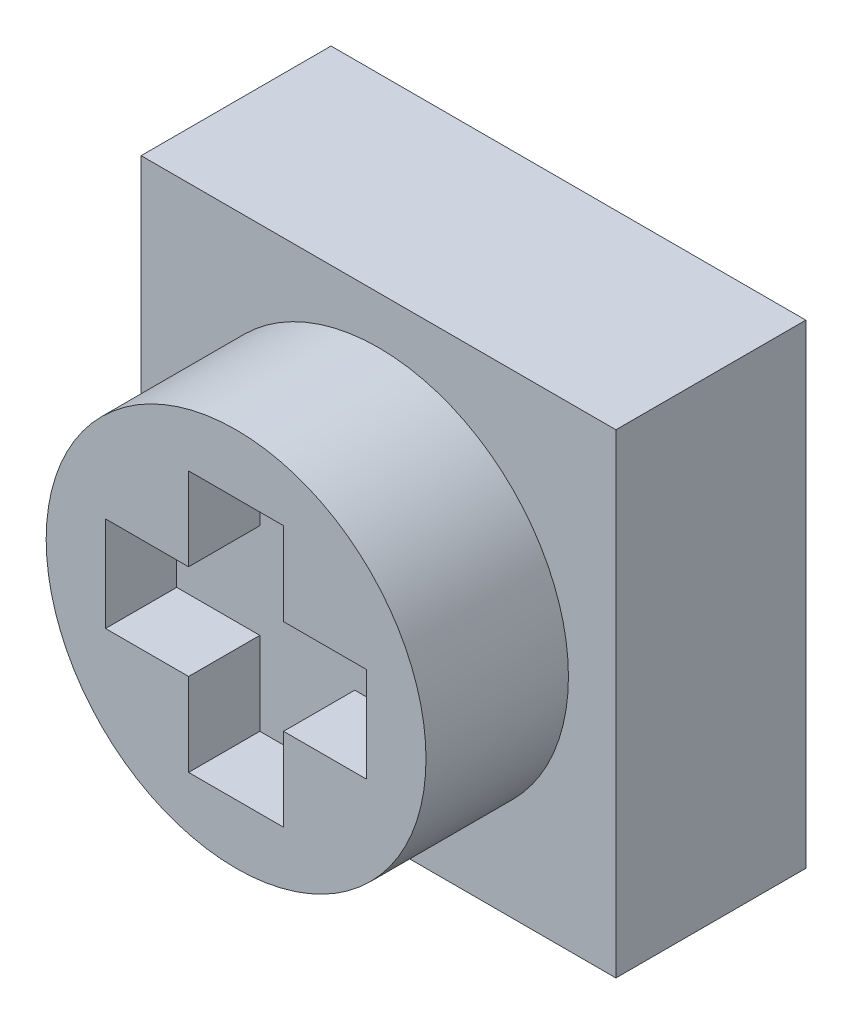
ISO-10303-21;
HEADER;
FILE_DESCRIPTION(('STEP AP214'),'2;1');
FILE_NAME('part.step','',(''),(''),'','','');
FILE_SCHEMA(('AUTOMOTIVE_DESIGN { 1 0 10303 214 1 1 1 1 }'));
ENDSEC;
DATA;
#1=APPLICATION_CONTEXT('core data for automotive mechanical design processes');
#2=APPLICATION_PROTOCOL_DEFINITION('international standard','automotive_design',2000,#1);
#3=PRODUCT_CONTEXT('',#1,'mechanical');
#4=PRODUCT('Part','Part','',(#3));
#5=PRODUCT_RELATED_PRODUCT_CATEGORY('part','',(#4));
#6=PRODUCT_DEFINITION_FORMATION('','',#4);
#7=PRODUCT_DEFINITION_CONTEXT('part definition',#1,'design');
#8=PRODUCT_DEFINITION('design','',#6,#7);
#9=PRODUCT_DEFINITION_SHAPE('','',#8);
#10=(LENGTH_UNIT() NAMED_UNIT(*) SI_UNIT(.MILLI.,.METRE.));
#11=(NAMED_UNIT(*) PLANE_ANGLE_UNIT() SI_UNIT($,.RADIAN.));
#12=(NAMED_UNIT(*) SI_UNIT($,.STERADIAN.) SOLID_ANGLE_UNIT());
#13=UNCERTAINTY_MEASURE_WITH_UNIT(LENGTH_MEASURE(1.E-05),#10,'distance_accuracy_value','');
#14=(GEOMETRIC_REPRESENTATION_CONTEXT(3) GLOBAL_UNCERTAINTY_ASSIGNED_CONTEXT((#13)) GLOBAL_UNIT_ASSIGNED_CONTEXT((#10,
#11,#12)) REPRESENTATION_CONTEXT('',''));
#15=CARTESIAN_POINT('',(0.,0.,0.));
#16=DIRECTION('',(0.,0.,1.));
#17=DIRECTION('',(1.,0.,0.));
#18=AXIS2_PLACEMENT_3D('',#15,#16,#17);
#19=CARTESIAN_POINT('',(0.,0.,4.));
#20=DIRECTION('',(1.,0.,0.));
#21=DIRECTION('',(0.,0.,-1.));
#22=AXIS2_PLACEMENT_3D('',#19,#20,#21);
#23=PLANE('',#22);
#24=DIRECTION('',(0.,-1.,0.));
#25=VECTOR('',#24,1.);
#26=CARTESIAN_POINT('',(0.,0.,0.));
#27=LINE('',#26,#25);
#28=CARTESIAN_POINT('',(0.,0.,0.));
#29=VERTEX_POINT('',#28);
#30=CARTESIAN_POINT('',(0.,-10.,0.));
#31=VERTEX_POINT('',#30);
#32=EDGE_CURVE('E264',#29,#31,#27,.T.);
#33=ORIENTED_EDGE('',*,*,#32,.T.);
#34=DIRECTION('',(0.,0.,-1.));
#35=VECTOR('',#34,1.);
#36=CARTESIAN_POINT('',(0.,-10.,4.));
#37=LINE('',#36,#35);
#38=CARTESIAN_POINT('',(0.,-10.,4.));
#39=VERTEX_POINT('',#38);
#40=EDGE_CURVE('E40',#39,#31,#37,.T.);
#41=ORIENTED_EDGE('',*,*,#40,.F.);
#42=DIRECTION('',(0.,-1.,0.));
#43=VECTOR('',#42,1.);
#44=CARTESIAN_POINT('',(0.,0.,4.));
#45=LINE('',#44,#43);
#46=CARTESIAN_POINT('',(0.,0.,4.));
#47=VERTEX_POINT('',#46);
#48=EDGE_CURVE('E266',#47,#39,#45,.T.);
#49=ORIENTED_EDGE('',*,*,#48,.F.);
#50=DIRECTION('',(0.,0.,-1.));
#51=VECTOR('',#50,1.);
#52=CARTESIAN_POINT('',(0.,0.,4.));
#53=LINE('',#52,#51);
#54=EDGE_CURVE('E272',#47,#29,#53,.T.);
#55=ORIENTED_EDGE('',*,*,#54,.T.);
#56=EDGE_LOOP('',(#33,#41,#49,#55));
#57=FACE_BOUND('',#56,.T.);
#58=ADVANCED_FACE('F37',(#57),#23,.F.);
#59=CARTESIAN_POINT('',(0.,-10.,4.));
#60=DIRECTION('',(0.,1.,0.));
#61=DIRECTION('',(0.,0.,1.));
#62=AXIS2_PLACEMENT_3D('',#59,#60,#61);
#63=PLANE('',#62);
#64=DIRECTION('',(1.,0.,0.));
#65=VECTOR('',#64,1.);
#66=CARTESIAN_POINT('',(0.,-10.,0.));
#67=LINE('',#66,#65);
#68=CARTESIAN_POINT('',(10.,-10.,0.));
#69=VERTEX_POINT('',#68);
#70=EDGE_CURVE('E275',#31,#69,#67,.T.);
#71=ORIENTED_EDGE('',*,*,#70,.T.);
#72=DIRECTION('',(0.,0.,-1.));
#73=VECTOR('',#72,1.);
#74=CARTESIAN_POINT('',(10.,-10.,4.));
#75=LINE('',#74,#73);
#76=CARTESIAN_POINT('',(10.,-10.,4.));
#77=VERTEX_POINT('',#76);
#78=EDGE_CURVE('E282',#77,#69,#75,.T.);
#79=ORIENTED_EDGE('',*,*,#78,.F.);
#80=DIRECTION('',(1.,0.,0.));
#81=VECTOR('',#80,1.);
#82=CARTESIAN_POINT('',(0.,-10.,4.));
#83=LINE('',#82,#81);
#84=EDGE_CURVE('E90',#39,#77,#83,.T.);
#85=ORIENTED_EDGE('',*,*,#84,.F.);
#86=ORIENTED_EDGE('',*,*,#40,.T.);
#87=EDGE_LOOP('',(#71,#79,#85,#86));
#88=FACE_BOUND('',#87,.T.);
#89=ADVANCED_FACE('F288',(#88),#63,.F.);
#90=CARTESIAN_POINT('',(10.,0.,4.));
#91=DIRECTION('',(-1.,0.,0.));
#92=DIRECTION('',(0.,-1.,0.));
#93=AXIS2_PLACEMENT_3D('',#90,#91,#92);
#94=PLANE('',#93);
#95=DIRECTION('',(0.,1.,0.));
#96=VECTOR('',#95,1.);
#97=CARTESIAN_POINT('',(10.,0.,0.));
#98=LINE('',#97,#96);
#99=CARTESIAN_POINT('',(10.,0.,0.));
#100=VERTEX_POINT('',#99);
#101=EDGE_CURVE('E277',#69,#100,#98,.T.);
#102=ORIENTED_EDGE('',*,*,#101,.T.);
#103=DIRECTION('',(0.,0.,-1.));
#104=VECTOR('',#103,1.);
#105=CARTESIAN_POINT('',(10.,0.,4.));
#106=LINE('',#105,#104);
#107=CARTESIAN_POINT('',(10.,0.,4.));
#108=VERTEX_POINT('',#107);
#109=EDGE_CURVE('E281',#108,#100,#106,.T.);
#110=ORIENTED_EDGE('',*,*,#109,.F.);
#111=DIRECTION('',(0.,1.,0.));
#112=VECTOR('',#111,1.);
#113=CARTESIAN_POINT('',(10.,0.,4.));
#114=LINE('',#113,#112);
#115=EDGE_CURVE('E269',#77,#108,#114,.T.);
#116=ORIENTED_EDGE('',*,*,#115,.F.);
#117=ORIENTED_EDGE('',*,*,#78,.T.);
#118=EDGE_LOOP('',(#102,#110,#116,#117));
#119=FACE_BOUND('',#118,.T.);
#120=ADVANCED_FACE('F295',(#119),#94,.F.);
#121=CARTESIAN_POINT('',(0.,0.,4.));
#122=DIRECTION('',(0.,-1.,0.));
#123=DIRECTION('',(0.,0.,-1.));
#124=AXIS2_PLACEMENT_3D('',#121,#122,#123);
#125=PLANE('',#124);
#126=DIRECTION('',(-1.,0.,0.));
#127=VECTOR('',#126,1.);
#128=CARTESIAN_POINT('',(0.,0.,0.));
#129=LINE('',#128,#127);
#130=EDGE_CURVE('E82',#100,#29,#129,.T.);
#131=ORIENTED_EDGE('',*,*,#130,.T.);
#132=ORIENTED_EDGE('',*,*,#54,.F.);
#133=DIRECTION('',(-1.,0.,0.));
#134=VECTOR('',#133,1.);
#135=CARTESIAN_POINT('',(0.,0.,4.));
#136=LINE('',#135,#134);
#137=EDGE_CURVE('E61',#108,#47,#136,.T.);
#138=ORIENTED_EDGE('',*,*,#137,.F.);
#139=ORIENTED_EDGE('',*,*,#109,.T.);
#140=EDGE_LOOP('',(#131,#132,#138,#139));
#141=FACE_BOUND('',#140,.T.);
#142=ADVANCED_FACE('F296',(#141),#125,.F.);
#143=CARTESIAN_POINT('',(0.,0.,4.));
#144=DIRECTION('',(0.,0.,1.));
#145=DIRECTION('',(1.,0.,0.));
#146=AXIS2_PLACEMENT_3D('',#143,#144,#145);
#147=PLANE('',#146);
#148=CARTESIAN_POINT('',(5.,-5.,4.));
#149=DIRECTION('',(0.,0.,1.));
#150=DIRECTION('',(1.,0.,0.));
#151=AXIS2_PLACEMENT_3D('',#148,#149,#150);
#152=CIRCLE('',#151,4.);
#153=CARTESIAN_POINT('',(9.,-5.,4.));
#154=VERTEX_POINT('',#153);
#155=EDGE_CURVE('E11',#154,#154,#152,.T.);
#156=ORIENTED_EDGE('',*,*,#155,.F.);
#157=EDGE_LOOP('',(#156));
#158=FACE_BOUND('',#157,.T.);
#159=ORIENTED_EDGE('',*,*,#48,.T.);
#160=ORIENTED_EDGE('',*,*,#84,.T.);
#161=ORIENTED_EDGE('',*,*,#115,.T.);
#162=ORIENTED_EDGE('',*,*,#137,.T.);
#163=EDGE_LOOP('',(#159,#160,#161,#162));
#164=FACE_BOUND('',#163,.T.);
#165=ADVANCED_FACE('F297',(#158,#164),#147,.T.);
#166=CARTESIAN_POINT('',(0.,0.,0.));
#167=DIRECTION('',(0.,0.,1.));
#168=DIRECTION('',(1.,0.,0.));
#169=AXIS2_PLACEMENT_3D('',#166,#167,#168);
#170=PLANE('',#169);
#171=ORIENTED_EDGE('',*,*,#32,.F.);
#172=ORIENTED_EDGE('',*,*,#130,.F.);
#173=ORIENTED_EDGE('',*,*,#101,.F.);
#174=ORIENTED_EDGE('',*,*,#70,.F.);
#175=EDGE_LOOP('',(#171,#172,#173,#174));
#176=FACE_BOUND('',#175,.T.);
#177=ADVANCED_FACE('F293',(#176),#170,.F.);
#178=CARTESIAN_POINT('',(5.,-5.,7.));
#179=DIRECTION('',(0.,0.,-1.));
#180=DIRECTION('',(-1.,0.,0.));
#181=AXIS2_PLACEMENT_3D('',#178,#179,#180);
#182=CYLINDRICAL_SURFACE('',#181,4.);
#183=CARTESIAN_POINT('',(5.,-5.,7.));
#184=DIRECTION('',(0.,0.,1.));
#185=DIRECTION('',(1.,0.,0.));
#186=AXIS2_PLACEMENT_3D('',#183,#184,#185);
#187=CIRCLE('',#186,4.);
#188=CARTESIAN_POINT('',(9.,-5.,7.));
#189=VERTEX_POINT('',#188);
#190=EDGE_CURVE('E243',#189,#189,#187,.T.);
#191=ORIENTED_EDGE('',*,*,#190,.F.);
#192=EDGE_LOOP('',(#191));
#193=FACE_BOUND('',#192,.T.);
#194=ORIENTED_EDGE('',*,*,#155,.T.);
#195=EDGE_LOOP('',(#194));
#196=FACE_BOUND('',#195,.T.);
#197=ADVANCED_FACE('F305',(#193,#196),#182,.T.);
#198=CARTESIAN_POINT('',(5.,-5.,7.));
#199=DIRECTION('',(0.,0.,1.));
#200=DIRECTION('',(1.,0.,0.));
#201=AXIS2_PLACEMENT_3D('',#198,#199,#200);
#202=PLANE('',#201);
#203=DIRECTION('',(-1.,0.,0.));
#204=VECTOR('',#203,1.);
#205=CARTESIAN_POINT('',(6.,-2.25,7.));
#206=LINE('',#205,#204);
#207=CARTESIAN_POINT('',(6.,-2.25,7.));
#208=VERTEX_POINT('',#207);
#209=CARTESIAN_POINT('',(4.,-2.25,7.));
#210=VERTEX_POINT('',#209);
#211=EDGE_CURVE('E52',#208,#210,#206,.T.);
#212=ORIENTED_EDGE('',*,*,#211,.F.);
#213=DIRECTION('',(0.,1.,0.));
#214=VECTOR('',#213,1.);
#215=CARTESIAN_POINT('',(6.,-4.,7.));
#216=LINE('',#215,#214);
#217=CARTESIAN_POINT('',(6.,-4.,7.));
#218=VERTEX_POINT('',#217);
#219=EDGE_CURVE('E181',#218,#208,#216,.T.);
#220=ORIENTED_EDGE('',*,*,#219,.F.);
#221=DIRECTION('',(-1.,0.,0.));
#222=VECTOR('',#221,1.);
#223=CARTESIAN_POINT('',(7.75,-4.,7.));
#224=LINE('',#223,#222);
#225=CARTESIAN_POINT('',(7.75,-4.,7.));
#226=VERTEX_POINT('',#225);
#227=EDGE_CURVE('E184',#226,#218,#224,.T.);
#228=ORIENTED_EDGE('',*,*,#227,.F.);
#229=DIRECTION('',(0.,1.,0.));
#230=VECTOR('',#229,1.);
#231=CARTESIAN_POINT('',(7.75,-6.,7.));
#232=LINE('',#231,#230);
#233=CARTESIAN_POINT('',(7.75,-6.,7.));
#234=VERTEX_POINT('',#233);
#235=EDGE_CURVE('E236',#234,#226,#232,.T.);
#236=ORIENTED_EDGE('',*,*,#235,.F.);
#237=DIRECTION('',(1.,0.,0.));
#238=VECTOR('',#237,1.);
#239=CARTESIAN_POINT('',(7.75,-6.,7.));
#240=LINE('',#239,#238);
#241=CARTESIAN_POINT('',(6.,-6.,7.));
#242=VERTEX_POINT('',#241);
#243=EDGE_CURVE('E233',#242,#234,#240,.T.);
#244=ORIENTED_EDGE('',*,*,#243,.F.);
#245=DIRECTION('',(0.,1.,0.));
#246=VECTOR('',#245,1.);
#247=CARTESIAN_POINT('',(6.,-7.75,7.));
#248=LINE('',#247,#246);
#249=CARTESIAN_POINT('',(6.,-7.75,7.));
#250=VERTEX_POINT('',#249);
#251=EDGE_CURVE('E230',#250,#242,#248,.T.);
#252=ORIENTED_EDGE('',*,*,#251,.F.);
#253=DIRECTION('',(1.,0.,0.));
#254=VECTOR('',#253,1.);
#255=CARTESIAN_POINT('',(6.,-7.75,7.));
#256=LINE('',#255,#254);
#257=CARTESIAN_POINT('',(4.,-7.75,7.));
#258=VERTEX_POINT('',#257);
#259=EDGE_CURVE('E227',#258,#250,#256,.T.);
#260=ORIENTED_EDGE('',*,*,#259,.F.);
#261=DIRECTION('',(0.,-1.,0.));
#262=VECTOR('',#261,1.);
#263=CARTESIAN_POINT('',(4.,-7.75,7.));
#264=LINE('',#263,#262);
#265=CARTESIAN_POINT('',(4.,-6.,7.));
#266=VERTEX_POINT('',#265);
#267=EDGE_CURVE('E224',#266,#258,#264,.T.);
#268=ORIENTED_EDGE('',*,*,#267,.F.);
#269=DIRECTION('',(1.,0.,0.));
#270=VECTOR('',#269,1.);
#271=CARTESIAN_POINT('',(4.,-6.,7.));
#272=LINE('',#271,#270);
#273=CARTESIAN_POINT('',(2.25,-6.,7.));
#274=VERTEX_POINT('',#273);
#275=EDGE_CURVE('E221',#274,#266,#272,.T.);
#276=ORIENTED_EDGE('',*,*,#275,.F.);
#277=DIRECTION('',(0.,-1.,0.));
#278=VECTOR('',#277,1.);
#279=CARTESIAN_POINT('',(2.25,-6.,7.));
#280=LINE('',#279,#278);
#281=CARTESIAN_POINT('',(2.25,-4.,7.));
#282=VERTEX_POINT('',#281);
#283=EDGE_CURVE('E218',#282,#274,#280,.T.);
#284=ORIENTED_EDGE('',*,*,#283,.F.);
#285=DIRECTION('',(-1.,0.,0.));
#286=VECTOR('',#285,1.);
#287=CARTESIAN_POINT('',(4.,-4.,7.));
#288=LINE('',#287,#286);
#289=CARTESIAN_POINT('',(4.,-4.,7.));
#290=VERTEX_POINT('',#289);
#291=EDGE_CURVE('E215',#290,#282,#288,.T.);
#292=ORIENTED_EDGE('',*,*,#291,.F.);
#293=DIRECTION('',(0.,-1.,0.));
#294=VECTOR('',#293,1.);
#295=CARTESIAN_POINT('',(4.,-4.,7.));
#296=LINE('',#295,#294);
#297=EDGE_CURVE('E213',#210,#290,#296,.T.);
#298=ORIENTED_EDGE('',*,*,#297,.F.);
#299=EDGE_LOOP('',(#212,#220,#228,#236,#244,#252,#260,#268,#276,#284,#292,#298));
#300=FACE_BOUND('',#299,.T.);
#301=ORIENTED_EDGE('',*,*,#190,.T.);
#302=EDGE_LOOP('',(#301));
#303=FACE_BOUND('',#302,.T.);
#304=ADVANCED_FACE('F343',(#300,#303),#202,.T.);
#305=CARTESIAN_POINT('',(6.,-2.25,5.5));
#306=DIRECTION('',(0.,1.,0.));
#307=DIRECTION('',(-1.,0.,0.));
#308=AXIS2_PLACEMENT_3D('',#305,#306,#307);
#309=PLANE('',#308);
#310=ORIENTED_EDGE('',*,*,#211,.T.);
#311=DIRECTION('',(0.,0.,1.));
#312=VECTOR('',#311,1.);
#313=CARTESIAN_POINT('',(4.,-2.25,5.5));
#314=LINE('',#313,#312);
#315=CARTESIAN_POINT('',(4.,-2.25,5.5));
#316=VERTEX_POINT('',#315);
#317=EDGE_CURVE('E158',#316,#210,#314,.T.);
#318=ORIENTED_EDGE('',*,*,#317,.F.);
#319=DIRECTION('',(-1.,0.,0.));
#320=VECTOR('',#319,1.);
#321=CARTESIAN_POINT('',(6.,-2.25,5.5));
#322=LINE('',#321,#320);
#323=CARTESIAN_POINT('',(6.,-2.25,5.5));
#324=VERTEX_POINT('',#323);
#325=EDGE_CURVE('E162',#324,#316,#322,.T.);
#326=ORIENTED_EDGE('',*,*,#325,.F.);
#327=DIRECTION('',(0.,0.,1.));
#328=VECTOR('',#327,1.);
#329=CARTESIAN_POINT('',(6.,-2.25,5.5));
#330=LINE('',#329,#328);
#331=EDGE_CURVE('E241',#324,#208,#330,.T.);
#332=ORIENTED_EDGE('',*,*,#331,.T.);
#333=EDGE_LOOP('',(#310,#318,#326,#332));
#334=FACE_BOUND('',#333,.T.);
#335=ADVANCED_FACE('F160',(#334),#309,.F.);
#336=CARTESIAN_POINT('',(6.,-4.,5.5));
#337=DIRECTION('',(1.,0.,0.));
#338=DIRECTION('',(0.,0.,-1.));
#339=AXIS2_PLACEMENT_3D('',#336,#337,#338);
#340=PLANE('',#339);
#341=ORIENTED_EDGE('',*,*,#219,.T.);
#342=ORIENTED_EDGE('',*,*,#331,.F.);
#343=DIRECTION('',(0.,1.,0.));
#344=VECTOR('',#343,1.);
#345=CARTESIAN_POINT('',(6.,-4.,5.5));
#346=LINE('',#345,#344);
#347=CARTESIAN_POINT('',(6.,-4.,5.5));
#348=VERTEX_POINT('',#347);
#349=EDGE_CURVE('E168',#348,#324,#346,.T.);
#350=ORIENTED_EDGE('',*,*,#349,.F.);
#351=DIRECTION('',(0.,0.,1.));
#352=VECTOR('',#351,1.);
#353=CARTESIAN_POINT('',(6.,-4.,5.5));
#354=LINE('',#353,#352);
#355=EDGE_CURVE('E244',#348,#218,#354,.T.);
#356=ORIENTED_EDGE('',*,*,#355,.T.);
#357=EDGE_LOOP('',(#341,#342,#350,#356));
#358=FACE_BOUND('',#357,.T.);
#359=ADVANCED_FACE('F361',(#358),#340,.F.);
#360=CARTESIAN_POINT('',(7.75,-4.,5.5));
#361=DIRECTION('',(0.,1.,0.));
#362=DIRECTION('',(0.,0.,1.));
#363=AXIS2_PLACEMENT_3D('',#360,#361,#362);
#364=PLANE('',#363);
#365=ORIENTED_EDGE('',*,*,#227,.T.);
#366=ORIENTED_EDGE('',*,*,#355,.F.);
#367=DIRECTION('',(-1.,0.,0.));
#368=VECTOR('',#367,1.);
#369=CARTESIAN_POINT('',(7.75,-4.,5.5));
#370=LINE('',#369,#368);
#371=CARTESIAN_POINT('',(7.75,-4.,5.5));
#372=VERTEX_POINT('',#371);
#373=EDGE_CURVE('E209',#372,#348,#370,.T.);
#374=ORIENTED_EDGE('',*,*,#373,.F.);
#375=DIRECTION('',(0.,0.,1.));
#376=VECTOR('',#375,1.);
#377=CARTESIAN_POINT('',(7.75,-4.,5.5));
#378=LINE('',#377,#376);
#379=EDGE_CURVE('E246',#372,#226,#378,.T.);
#380=ORIENTED_EDGE('',*,*,#379,.T.);
#381=EDGE_LOOP('',(#365,#366,#374,#380));
#382=FACE_BOUND('',#381,.T.);
#383=ADVANCED_FACE('F370',(#382),#364,.F.);
#384=CARTESIAN_POINT('',(7.75,-6.,5.5));
#385=DIRECTION('',(1.,0.,0.));
#386=DIRECTION('',(0.,0.,-1.));
#387=AXIS2_PLACEMENT_3D('',#384,#385,#386);
#388=PLANE('',#387);
#389=ORIENTED_EDGE('',*,*,#235,.T.);
#390=ORIENTED_EDGE('',*,*,#379,.F.);
#391=DIRECTION('',(0.,1.,0.));
#392=VECTOR('',#391,1.);
#393=CARTESIAN_POINT('',(7.75,-6.,5.5));
#394=LINE('',#393,#392);
#395=CARTESIAN_POINT('',(7.75,-6.,5.5));
#396=VERTEX_POINT('',#395);
#397=EDGE_CURVE('E206',#396,#372,#394,.T.);
#398=ORIENTED_EDGE('',*,*,#397,.F.);
#399=DIRECTION('',(0.,0.,1.));
#400=VECTOR('',#399,1.);
#401=CARTESIAN_POINT('',(7.75,-6.,5.5));
#402=LINE('',#401,#400);
#403=EDGE_CURVE('E248',#396,#234,#402,.T.);
#404=ORIENTED_EDGE('',*,*,#403,.T.);
#405=EDGE_LOOP('',(#389,#390,#398,#404));
#406=FACE_BOUND('',#405,.T.);
#407=ADVANCED_FACE('F380',(#406),#388,.F.);
#408=CARTESIAN_POINT('',(7.75,-6.,5.5));
#409=DIRECTION('',(0.,-1.,0.));
#410=DIRECTION('',(0.,0.,-1.));
#411=AXIS2_PLACEMENT_3D('',#408,#409,#410);
#412=PLANE('',#411);
#413=ORIENTED_EDGE('',*,*,#243,.T.);
#414=ORIENTED_EDGE('',*,*,#403,.F.);
#415=DIRECTION('',(1.,0.,0.));
#416=VECTOR('',#415,1.);
#417=CARTESIAN_POINT('',(7.75,-6.,5.5));
#418=LINE('',#417,#416);
#419=CARTESIAN_POINT('',(6.,-6.,5.5));
#420=VERTEX_POINT('',#419);
#421=EDGE_CURVE('E203',#420,#396,#418,.T.);
#422=ORIENTED_EDGE('',*,*,#421,.F.);
#423=DIRECTION('',(0.,0.,1.));
#424=VECTOR('',#423,1.);
#425=CARTESIAN_POINT('',(6.,-6.,5.5));
#426=LINE('',#425,#424);
#427=EDGE_CURVE('E250',#420,#242,#426,.T.);
#428=ORIENTED_EDGE('',*,*,#427,.T.);
#429=EDGE_LOOP('',(#413,#414,#422,#428));
#430=FACE_BOUND('',#429,.T.);
#431=ADVANCED_FACE('F390',(#430),#412,.F.);
#432=CARTESIAN_POINT('',(6.,-7.75,5.5));
#433=DIRECTION('',(1.,0.,0.));
#434=DIRECTION('',(0.,0.,-1.));
#435=AXIS2_PLACEMENT_3D('',#432,#433,#434);
#436=PLANE('',#435);
#437=ORIENTED_EDGE('',*,*,#251,.T.);
#438=ORIENTED_EDGE('',*,*,#427,.F.);
#439=DIRECTION('',(0.,1.,0.));
#440=VECTOR('',#439,1.);
#441=CARTESIAN_POINT('',(6.,-7.75,5.5));
#442=LINE('',#441,#440);
#443=CARTESIAN_POINT('',(6.,-7.75,5.5));
#444=VERTEX_POINT('',#443);
#445=EDGE_CURVE('E200',#444,#420,#442,.T.);
#446=ORIENTED_EDGE('',*,*,#445,.F.);
#447=DIRECTION('',(0.,0.,1.));
#448=VECTOR('',#447,1.);
#449=CARTESIAN_POINT('',(6.,-7.75,5.5));
#450=LINE('',#449,#448);
#451=EDGE_CURVE('E252',#444,#250,#450,.T.);
#452=ORIENTED_EDGE('',*,*,#451,.T.);
#453=EDGE_LOOP('',(#437,#438,#446,#452));
#454=FACE_BOUND('',#453,.T.);
#455=ADVANCED_FACE('F400',(#454),#436,.F.);
#456=CARTESIAN_POINT('',(6.,-7.75,5.5));
#457=DIRECTION('',(0.,-1.,0.));
#458=DIRECTION('',(0.,0.,-1.));
#459=AXIS2_PLACEMENT_3D('',#456,#457,#458);
#460=PLANE('',#459);
#461=ORIENTED_EDGE('',*,*,#259,.T.);
#462=ORIENTED_EDGE('',*,*,#451,.F.);
#463=DIRECTION('',(1.,0.,0.));
#464=VECTOR('',#463,1.);
#465=CARTESIAN_POINT('',(6.,-7.75,5.5));
#466=LINE('',#465,#464);
#467=CARTESIAN_POINT('',(4.,-7.75,5.5));
#468=VERTEX_POINT('',#467);
#469=EDGE_CURVE('E197',#468,#444,#466,.T.);
#470=ORIENTED_EDGE('',*,*,#469,.F.);
#471=DIRECTION('',(0.,0.,1.));
#472=VECTOR('',#471,1.);
#473=CARTESIAN_POINT('',(4.,-7.75,5.5));
#474=LINE('',#473,#472);
#475=EDGE_CURVE('E254',#468,#258,#474,.T.);
#476=ORIENTED_EDGE('',*,*,#475,.T.);
#477=EDGE_LOOP('',(#461,#462,#470,#476));
#478=FACE_BOUND('',#477,.T.);
#479=ADVANCED_FACE('F410',(#478),#460,.F.);
#480=CARTESIAN_POINT('',(4.,-7.75,5.5));
#481=DIRECTION('',(-1.,0.,0.));
#482=DIRECTION('',(0.,0.,1.));
#483=AXIS2_PLACEMENT_3D('',#480,#481,#482);
#484=PLANE('',#483);
#485=ORIENTED_EDGE('',*,*,#267,.T.);
#486=ORIENTED_EDGE('',*,*,#475,.F.);
#487=DIRECTION('',(0.,-1.,0.));
#488=VECTOR('',#487,1.);
#489=CARTESIAN_POINT('',(4.,-7.75,5.5));
#490=LINE('',#489,#488);
#491=CARTESIAN_POINT('',(4.,-6.,5.5));
#492=VERTEX_POINT('',#491);
#493=EDGE_CURVE('E194',#492,#468,#490,.T.);
#494=ORIENTED_EDGE('',*,*,#493,.F.);
#495=DIRECTION('',(0.,0.,1.));
#496=VECTOR('',#495,1.);
#497=CARTESIAN_POINT('',(4.,-6.,5.5));
#498=LINE('',#497,#496);
#499=EDGE_CURVE('E256',#492,#266,#498,.T.);
#500=ORIENTED_EDGE('',*,*,#499,.T.);
#501=EDGE_LOOP('',(#485,#486,#494,#500));
#502=FACE_BOUND('',#501,.T.);
#503=ADVANCED_FACE('F420',(#502),#484,.F.);
#504=CARTESIAN_POINT('',(4.,-6.,5.5));
#505=DIRECTION('',(0.,-1.,0.));
#506=DIRECTION('',(0.,0.,-1.));
#507=AXIS2_PLACEMENT_3D('',#504,#505,#506);
#508=PLANE('',#507);
#509=ORIENTED_EDGE('',*,*,#275,.T.);
#510=ORIENTED_EDGE('',*,*,#499,.F.);
#511=DIRECTION('',(1.,0.,0.));
#512=VECTOR('',#511,1.);
#513=CARTESIAN_POINT('',(4.,-6.,5.5));
#514=LINE('',#513,#512);
#515=CARTESIAN_POINT('',(2.25,-6.,5.5));
#516=VERTEX_POINT('',#515);
#517=EDGE_CURVE('E191',#516,#492,#514,.T.);
#518=ORIENTED_EDGE('',*,*,#517,.F.);
#519=DIRECTION('',(0.,0.,1.));
#520=VECTOR('',#519,1.);
#521=CARTESIAN_POINT('',(2.25,-6.,5.5));
#522=LINE('',#521,#520);
#523=EDGE_CURVE('E258',#516,#274,#522,.T.);
#524=ORIENTED_EDGE('',*,*,#523,.T.);
#525=EDGE_LOOP('',(#509,#510,#518,#524));
#526=FACE_BOUND('',#525,.T.);
#527=ADVANCED_FACE('F430',(#526),#508,.F.);
#528=CARTESIAN_POINT('',(2.25,-6.,5.5));
#529=DIRECTION('',(-1.,0.,0.));
#530=DIRECTION('',(0.,0.,1.));
#531=AXIS2_PLACEMENT_3D('',#528,#529,#530);
#532=PLANE('',#531);
#533=ORIENTED_EDGE('',*,*,#283,.T.);
#534=ORIENTED_EDGE('',*,*,#523,.F.);
#535=DIRECTION('',(0.,-1.,0.));
#536=VECTOR('',#535,1.);
#537=CARTESIAN_POINT('',(2.25,-6.,5.5));
#538=LINE('',#537,#536);
#539=CARTESIAN_POINT('',(2.25,-4.,5.5));
#540=VERTEX_POINT('',#539);
#541=EDGE_CURVE('E188',#540,#516,#538,.T.);
#542=ORIENTED_EDGE('',*,*,#541,.F.);
#543=DIRECTION('',(0.,0.,1.));
#544=VECTOR('',#543,1.);
#545=CARTESIAN_POINT('',(2.25,-4.,5.5));
#546=LINE('',#545,#544);
#547=EDGE_CURVE('E260',#540,#282,#546,.T.);
#548=ORIENTED_EDGE('',*,*,#547,.T.);
#549=EDGE_LOOP('',(#533,#534,#542,#548));
#550=FACE_BOUND('',#549,.T.);
#551=ADVANCED_FACE('F440',(#550),#532,.F.);
#552=CARTESIAN_POINT('',(4.,-4.,5.5));
#553=DIRECTION('',(0.,1.,0.));
#554=DIRECTION('',(0.,0.,1.));
#555=AXIS2_PLACEMENT_3D('',#552,#553,#554);
#556=PLANE('',#555);
#557=ORIENTED_EDGE('',*,*,#291,.T.);
#558=ORIENTED_EDGE('',*,*,#547,.F.);
#559=DIRECTION('',(-1.,0.,0.));
#560=VECTOR('',#559,1.);
#561=CARTESIAN_POINT('',(4.,-4.,5.5));
#562=LINE('',#561,#560);
#563=CARTESIAN_POINT('',(4.,-4.,5.5));
#564=VERTEX_POINT('',#563);
#565=EDGE_CURVE('E176',#564,#540,#562,.T.);
#566=ORIENTED_EDGE('',*,*,#565,.F.);
#567=DIRECTION('',(0.,0.,1.));
#568=VECTOR('',#567,1.);
#569=CARTESIAN_POINT('',(4.,-4.,5.5));
#570=LINE('',#569,#568);
#571=EDGE_CURVE('E167',#564,#290,#570,.T.);
#572=ORIENTED_EDGE('',*,*,#571,.T.);
#573=EDGE_LOOP('',(#557,#558,#566,#572));
#574=FACE_BOUND('',#573,.T.);
#575=ADVANCED_FACE('F450',(#574),#556,.F.);
#576=CARTESIAN_POINT('',(4.,-4.,5.5));
#577=DIRECTION('',(-1.,0.,0.));
#578=DIRECTION('',(0.,0.,1.));
#579=AXIS2_PLACEMENT_3D('',#576,#577,#578);
#580=PLANE('',#579);
#581=ORIENTED_EDGE('',*,*,#297,.T.);
#582=ORIENTED_EDGE('',*,*,#571,.F.);
#583=DIRECTION('',(0.,-1.,0.));
#584=VECTOR('',#583,1.);
#585=CARTESIAN_POINT('',(4.,-4.,5.5));
#586=LINE('',#585,#584);
#587=EDGE_CURVE('E171',#316,#564,#586,.T.);
#588=ORIENTED_EDGE('',*,*,#587,.F.);
#589=ORIENTED_EDGE('',*,*,#317,.T.);
#590=EDGE_LOOP('',(#581,#582,#588,#589));
#591=FACE_BOUND('',#590,.T.);
#592=ADVANCED_FACE('F172',(#591),#580,.F.);
#593=CARTESIAN_POINT('',(0.,0.,5.5));
#594=DIRECTION('',(0.,0.,-1.));
#595=DIRECTION('',(-1.,0.,0.));
#596=AXIS2_PLACEMENT_3D('',#593,#594,#595);
#597=PLANE('',#596);
#598=ORIENTED_EDGE('',*,*,#325,.T.);
#599=ORIENTED_EDGE('',*,*,#587,.T.);
#600=ORIENTED_EDGE('',*,*,#565,.T.);
#601=ORIENTED_EDGE('',*,*,#541,.T.);
#602=ORIENTED_EDGE('',*,*,#517,.T.);
#603=ORIENTED_EDGE('',*,*,#493,.T.);
#604=ORIENTED_EDGE('',*,*,#469,.T.);
#605=ORIENTED_EDGE('',*,*,#445,.T.);
#606=ORIENTED_EDGE('',*,*,#421,.T.);
#607=ORIENTED_EDGE('',*,*,#397,.T.);
#608=ORIENTED_EDGE('',*,*,#373,.T.);
#609=ORIENTED_EDGE('',*,*,#349,.T.);
#610=EDGE_LOOP('',(#598,#599,#600,#601,#602,#603,#604,#605,#606,#607,#608,#609));
#611=FACE_BOUND('',#610,.T.);
#612=ADVANCED_FACE('F178',(#611),#597,.F.);
#613=CLOSED_SHELL('',(#58,#89,#120,#142,#165,#177,#197,#304,#335,#359,#383,#407,#431,#455,#479,
#503,#527,#551,#575,#592,#612));
#614=MANIFOLD_SOLID_BREP('B2',#613);
#615=ADVANCED_BREP_SHAPE_REPRESENTATION('',(#18,#614),#14);
#616=SHAPE_DEFINITION_REPRESENTATION(#9,#615);
ENDSEC;
END-ISO-10303-21;
